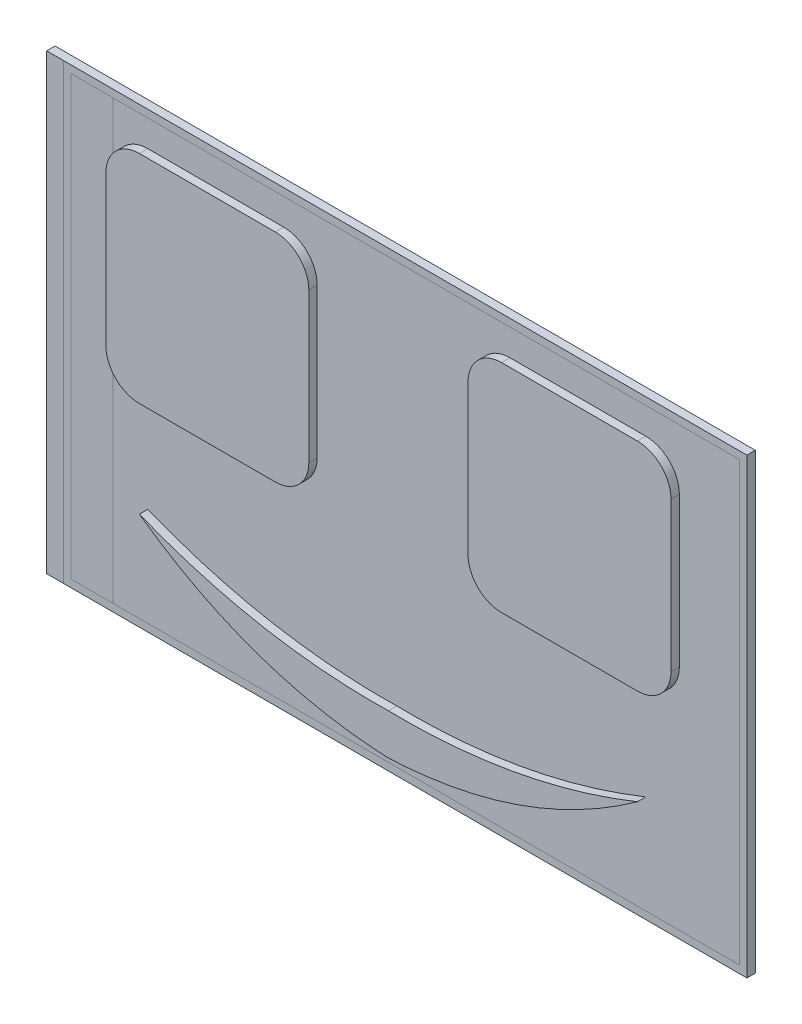
ISO-10303-21;
HEADER;
FILE_DESCRIPTION(('STEP AP214'),'2;1');
FILE_NAME('part.step','',(''),(''),'','','');
FILE_SCHEMA(('AUTOMOTIVE_DESIGN { 1 0 10303 214 1 1 1 1 }'));
ENDSEC;
DATA;
#1=APPLICATION_CONTEXT('core data for automotive mechanical design processes');
#2=APPLICATION_PROTOCOL_DEFINITION('international standard','automotive_design',2000,#1);
#3=PRODUCT_CONTEXT('',#1,'mechanical');
#4=PRODUCT('Part','Part','',(#3));
#5=PRODUCT_RELATED_PRODUCT_CATEGORY('part','',(#4));
#6=PRODUCT_DEFINITION_FORMATION('','',#4);
#7=PRODUCT_DEFINITION_CONTEXT('part definition',#1,'design');
#8=PRODUCT_DEFINITION('design','',#6,#7);
#9=PRODUCT_DEFINITION_SHAPE('','',#8);
#10=(LENGTH_UNIT() NAMED_UNIT(*) SI_UNIT(.MILLI.,.METRE.));
#11=(NAMED_UNIT(*) PLANE_ANGLE_UNIT() SI_UNIT($,.RADIAN.));
#12=(NAMED_UNIT(*) SI_UNIT($,.STERADIAN.) SOLID_ANGLE_UNIT());
#13=UNCERTAINTY_MEASURE_WITH_UNIT(LENGTH_MEASURE(1.E-05),#10,'distance_accuracy_value','');
#14=(GEOMETRIC_REPRESENTATION_CONTEXT(3) GLOBAL_UNCERTAINTY_ASSIGNED_CONTEXT((#13)) GLOBAL_UNIT_ASSIGNED_CONTEXT((#10,
#11,#12)) REPRESENTATION_CONTEXT('',''));
#15=CARTESIAN_POINT('',(0.,0.,0.));
#16=DIRECTION('',(0.,0.,1.));
#17=DIRECTION('',(1.,0.,0.));
#18=AXIS2_PLACEMENT_3D('',#15,#16,#17);
#19=CARTESIAN_POINT('',(0.,0.,4.));
#20=DIRECTION('',(0.,0.,1.));
#21=DIRECTION('',(1.,0.,0.));
#22=AXIS2_PLACEMENT_3D('',#19,#20,#21);
#23=PLANE('',#22);
#24=CARTESIAN_POINT('',(-29.6936225832858,-14.3272413143272,4.));
#25=CARTESIAN_POINT('',(-15.3381397208597,-20.090888715164,4.));
#26=CARTESIAN_POINT('',(-2.72004641033163E-12,-19.7764522537227,4.));
#27=B_SPLINE_CURVE_WITH_KNOTS('',2,(#24,#25,#26),.UNSPECIFIED.,.F.,.F.,(3,3),(0.,1.),.UNSPECIFIED.);
#28=CARTESIAN_POINT('',(-29.6936225832858,-14.3272413143272,4.));
#29=VERTEX_POINT('',#28);
#30=CARTESIAN_POINT('',(-2.80331313717852E-12,-19.7764522537227,4.));
#31=VERTEX_POINT('',#30);
#32=EDGE_CURVE('E233',#29,#31,#27,.T.);
#33=ORIENTED_EDGE('',*,*,#32,.T.);
#34=CARTESIAN_POINT('',(29.6936225832858,-14.3272413143265,4.));
#35=CARTESIAN_POINT('',(15.3381397208541,-20.0908887151647,4.));
#36=CARTESIAN_POINT('',(-2.88657986402541E-12,-19.7764522537227,4.));
#37=B_SPLINE_CURVE_WITH_KNOTS('',2,(#34,#35,#36),.UNSPECIFIED.,.F.,.F.,(3,3),(0.,1.),.UNSPECIFIED.);
#38=CARTESIAN_POINT('',(29.6936225832858,-14.3272413143265,4.));
#39=VERTEX_POINT('',#38);
#40=EDGE_CURVE('E252',#39,#31,#37,.T.);
#41=ORIENTED_EDGE('',*,*,#40,.F.);
#42=CARTESIAN_POINT('',(29.6936225832858,-14.3272413143265,4.));
#43=CARTESIAN_POINT('',(16.2293334087923,-23.9678209764464,4.));
#44=CARTESIAN_POINT('',(-2.88657986402541E-12,-24.6577244943396,4.));
#45=B_SPLINE_CURVE_WITH_KNOTS('',2,(#42,#43,#44),.UNSPECIFIED.,.F.,.F.,(3,3),(0.,1.),.UNSPECIFIED.);
#46=CARTESIAN_POINT('',(-2.80331313717852E-12,-24.6577244943396,4.));
#47=VERTEX_POINT('',#46);
#48=EDGE_CURVE('E57',#39,#47,#45,.T.);
#49=ORIENTED_EDGE('',*,*,#48,.T.);
#50=CARTESIAN_POINT('',(-29.6936225832858,-14.3272413143272,4.));
#51=CARTESIAN_POINT('',(-16.2293334087979,-23.9678209764464,4.));
#52=CARTESIAN_POINT('',(-2.72004641033163E-12,-24.6577244943396,4.));
#53=B_SPLINE_CURVE_WITH_KNOTS('',2,(#50,#51,#52),.UNSPECIFIED.,.F.,.F.,(3,3),(0.,1.),.UNSPECIFIED.);
#54=EDGE_CURVE('E737',#29,#47,#53,.T.);
#55=ORIENTED_EDGE('',*,*,#54,.F.);
#56=EDGE_LOOP('',(#33,#41,#49,#55));
#57=FACE_BOUND('',#56,.T.);
#58=CARTESIAN_POINT('',(13.4952908757193,18.9268430031263,4.));
#59=DIRECTION('',(0.,0.,0.999999999999991));
#60=DIRECTION('',(0.999999999999991,0.,0.));
#61=AXIS2_PLACEMENT_3D('',#58,#59,#60);
#62=CIRCLE('',#61,4.);
#63=CARTESIAN_POINT('',(9.49529087571932,18.9268430031263,4.));
#64=VERTEX_POINT('',#63);
#65=CARTESIAN_POINT('',(13.4952908757193,22.9268430031263,4.));
#66=VERTEX_POINT('',#65);
#67=EDGE_CURVE('E237',#64,#66,#62,.F.);
#68=ORIENTED_EDGE('',*,*,#67,.T.);
#69=DIRECTION('',(0.999999999999991,0.,0.));
#70=VECTOR('',#69,1.);
#71=CARTESIAN_POINT('',(0.,22.9268430031269,4.));
#72=LINE('',#71,#70);
#73=CARTESIAN_POINT('',(29.6936225832858,22.9268430031269,4.));
#74=VERTEX_POINT('',#73);
#75=EDGE_CURVE('E766',#66,#74,#72,.T.);
#76=ORIENTED_EDGE('',*,*,#75,.T.);
#77=CARTESIAN_POINT('',(29.6936225832858,18.9268430031268,4.));
#78=DIRECTION('',(0.,0.,0.999999999999991));
#79=DIRECTION('',(0.999999999999991,0.,0.));
#80=AXIS2_PLACEMENT_3D('',#77,#78,#79);
#81=CIRCLE('',#80,4.);
#82=CARTESIAN_POINT('',(33.6936225832858,18.9268430031268,4.));
#83=VERTEX_POINT('',#82);
#84=EDGE_CURVE('E797',#74,#83,#81,.F.);
#85=ORIENTED_EDGE('',*,*,#84,.T.);
#86=DIRECTION('',(0.,-1.,0.));
#87=VECTOR('',#86,1.);
#88=CARTESIAN_POINT('',(33.6936225832858,0.,4.));
#89=LINE('',#88,#87);
#90=CARTESIAN_POINT('',(33.6936225832858,1.10459654617266,4.));
#91=VERTEX_POINT('',#90);
#92=EDGE_CURVE('E795',#83,#91,#89,.T.);
#93=ORIENTED_EDGE('',*,*,#92,.T.);
#94=CARTESIAN_POINT('',(29.6936225832858,1.10459654617266,4.));
#95=DIRECTION('',(0.,0.,0.999999999999991));
#96=DIRECTION('',(0.999999999999991,0.,0.));
#97=AXIS2_PLACEMENT_3D('',#94,#95,#96);
#98=CIRCLE('',#97,4.);
#99=CARTESIAN_POINT('',(29.6936225832858,-2.89540345382734,4.));
#100=VERTEX_POINT('',#99);
#101=EDGE_CURVE('E792',#100,#91,#98,.T.);
#102=ORIENTED_EDGE('',*,*,#101,.F.);
#103=DIRECTION('',(0.999999999999991,0.,0.));
#104=VECTOR('',#103,1.);
#105=CARTESIAN_POINT('',(0.,-2.89540345382733,4.));
#106=LINE('',#105,#104);
#107=CARTESIAN_POINT('',(13.4952908757193,-2.89540345382733,4.));
#108=VERTEX_POINT('',#107);
#109=EDGE_CURVE('E789',#108,#100,#106,.T.);
#110=ORIENTED_EDGE('',*,*,#109,.F.);
#111=CARTESIAN_POINT('',(13.4952908757193,1.10459654617212,4.));
#112=DIRECTION('',(0.,0.,0.999999999999991));
#113=DIRECTION('',(0.999999999999991,0.,0.));
#114=AXIS2_PLACEMENT_3D('',#111,#112,#113);
#115=CIRCLE('',#114,4.);
#116=CARTESIAN_POINT('',(9.49529087571932,1.10459654617212,4.));
#117=VERTEX_POINT('',#116);
#118=EDGE_CURVE('E786',#117,#108,#115,.T.);
#119=ORIENTED_EDGE('',*,*,#118,.F.);
#120=DIRECTION('',(0.,-1.,0.));
#121=VECTOR('',#120,1.);
#122=CARTESIAN_POINT('',(9.49529087571932,-5.55111512312578E-13,4.));
#123=LINE('',#122,#121);
#124=EDGE_CURVE('E65',#64,#117,#123,.T.);
#125=ORIENTED_EDGE('',*,*,#124,.F.);
#126=EDGE_LOOP('',(#68,#76,#85,#93,#102,#110,#119,#125));
#127=FACE_BOUND('',#126,.T.);
#128=CARTESIAN_POINT('',(-29.6936225832858,18.9268430031264,4.));
#129=DIRECTION('',(0.,0.,0.999999999999993));
#130=DIRECTION('',(0.999999999999993,0.,0.));
#131=AXIS2_PLACEMENT_3D('',#128,#129,#130);
#132=CIRCLE('',#131,4.);
#133=CARTESIAN_POINT('',(-29.6936225832858,22.9268430031264,4.));
#134=VERTEX_POINT('',#133);
#135=CARTESIAN_POINT('',(-33.6936225832858,18.9268430031269,4.));
#136=VERTEX_POINT('',#135);
#137=EDGE_CURVE('E847',#134,#136,#132,.T.);
#138=ORIENTED_EDGE('',*,*,#137,.F.);
#139=DIRECTION('',(-0.999999999999993,0.,0.));
#140=VECTOR('',#139,1.);
#141=CARTESIAN_POINT('',(0.,22.9268430031269,4.));
#142=LINE('',#141,#140);
#143=CARTESIAN_POINT('',(-13.4952908757193,22.9268430031269,4.));
#144=VERTEX_POINT('',#143);
#145=EDGE_CURVE('E822',#144,#134,#142,.T.);
#146=ORIENTED_EDGE('',*,*,#145,.F.);
#147=CARTESIAN_POINT('',(-13.4952908757193,18.9268430031269,4.));
#148=DIRECTION('',(0.,0.,0.999999999999993));
#149=DIRECTION('',(0.999999999999993,0.,0.));
#150=AXIS2_PLACEMENT_3D('',#147,#148,#149);
#151=CIRCLE('',#150,4.);
#152=CARTESIAN_POINT('',(-9.49529087571932,18.9268430031269,4.));
#153=VERTEX_POINT('',#152);
#154=EDGE_CURVE('E827',#153,#144,#151,.T.);
#155=ORIENTED_EDGE('',*,*,#154,.F.);
#156=DIRECTION('',(0.,-1.,0.));
#157=VECTOR('',#156,1.);
#158=CARTESIAN_POINT('',(-9.49529087571932,0.,4.));
#159=LINE('',#158,#157);
#160=CARTESIAN_POINT('',(-9.49529087571932,1.10459654617266,4.));
#161=VERTEX_POINT('',#160);
#162=EDGE_CURVE('E861',#153,#161,#159,.T.);
#163=ORIENTED_EDGE('',*,*,#162,.T.);
#164=CARTESIAN_POINT('',(-13.4952908757193,1.10459654617222,4.));
#165=DIRECTION('',(0.,0.,0.999999999999993));
#166=DIRECTION('',(0.999999999999993,0.,0.));
#167=AXIS2_PLACEMENT_3D('',#164,#165,#166);
#168=CIRCLE('',#167,4.);
#169=CARTESIAN_POINT('',(-13.4952908757193,-2.89540345382733,4.));
#170=VERTEX_POINT('',#169);
#171=EDGE_CURVE('E858',#161,#170,#168,.F.);
#172=ORIENTED_EDGE('',*,*,#171,.T.);
#173=DIRECTION('',(-0.999999999999993,0.,0.));
#174=VECTOR('',#173,1.);
#175=CARTESIAN_POINT('',(0.,-2.89540345382733,4.));
#176=LINE('',#175,#174);
#177=CARTESIAN_POINT('',(-29.6936225832858,-2.89540345382779,4.));
#178=VERTEX_POINT('',#177);
#179=EDGE_CURVE('E855',#170,#178,#176,.T.);
#180=ORIENTED_EDGE('',*,*,#179,.T.);
#181=CARTESIAN_POINT('',(-29.6936225832858,1.10459654617222,4.));
#182=DIRECTION('',(0.,0.,0.999999999999993));
#183=DIRECTION('',(0.999999999999993,0.,0.));
#184=AXIS2_PLACEMENT_3D('',#181,#182,#183);
#185=CIRCLE('',#184,4.);
#186=CARTESIAN_POINT('',(-33.6936225832858,1.10459654617268,4.));
#187=VERTEX_POINT('',#186);
#188=EDGE_CURVE('E852',#178,#187,#185,.F.);
#189=ORIENTED_EDGE('',*,*,#188,.T.);
#190=DIRECTION('',(0.,-1.,0.));
#191=VECTOR('',#190,1.);
#192=CARTESIAN_POINT('',(-33.6936225832858,0.,4.));
#193=LINE('',#192,#191);
#194=EDGE_CURVE('E849',#136,#187,#193,.T.);
#195=ORIENTED_EDGE('',*,*,#194,.F.);
#196=EDGE_LOOP('',(#138,#146,#155,#163,#172,#180,#189,#195));
#197=FACE_BOUND('',#196,.T.);
#198=DIRECTION('',(0.,1.,0.));
#199=VECTOR('',#198,1.);
#200=CARTESIAN_POINT('',(-33.8500000000466,13.0510000005015,4.));
#201=LINE('',#200,#199);
#202=CARTESIAN_POINT('',(-33.8500000000466,-26.1000000000029,4.));
#203=VERTEX_POINT('',#202);
#204=CARTESIAN_POINT('',(-33.8500000000466,26.1000000000029,4.));
#205=VERTEX_POINT('',#204);
#206=EDGE_CURVE('E11',#203,#205,#201,.T.);
#207=ORIENTED_EDGE('',*,*,#206,.F.);
#208=DIRECTION('',(-1.,0.,0.));
#209=VECTOR('',#208,1.);
#210=CARTESIAN_POINT('',(-19.4250000000233,-26.1000000000029,4.));
#211=LINE('',#210,#209);
#212=CARTESIAN_POINT('',(40.850000000032,-26.1000000000029,4.));
#213=VERTEX_POINT('',#212);
#214=EDGE_CURVE('E405',#213,#203,#211,.T.);
#215=ORIENTED_EDGE('',*,*,#214,.F.);
#216=DIRECTION('',(0.,-1.,0.));
#217=VECTOR('',#216,1.);
#218=CARTESIAN_POINT('',(40.850000000032,-13.0500000000015,4.));
#219=LINE('',#218,#217);
#220=CARTESIAN_POINT('',(40.850000000032,26.1000000000029,4.));
#221=VERTEX_POINT('',#220);
#222=EDGE_CURVE('E422',#221,#213,#219,.T.);
#223=ORIENTED_EDGE('',*,*,#222,.F.);
#224=DIRECTION('',(1.,0.,0.));
#225=VECTOR('',#224,1.);
#226=CARTESIAN_POINT('',(20.425000000016,26.1000000000029,4.));
#227=LINE('',#226,#225);
#228=EDGE_CURVE('E410',#205,#221,#227,.T.);
#229=ORIENTED_EDGE('',*,*,#228,.F.);
#230=EDGE_LOOP('',(#207,#215,#223,#229));
#231=FACE_BOUND('',#230,.T.);
#232=ADVANCED_FACE('F39',(#57,#127,#197,#231),#23,.T.);
#233=CARTESIAN_POINT('',(0.,0.,4.));
#234=DIRECTION('',(0.,0.,1.));
#235=DIRECTION('',(1.,0.,0.));
#236=AXIS2_PLACEMENT_3D('',#233,#234,#235);
#237=PLANE('',#236);
#238=ORIENTED_EDGE('',*,*,#206,.T.);
#239=DIRECTION('',(1.,0.,0.));
#240=VECTOR('',#239,1.);
#241=CARTESIAN_POINT('',(20.425000000016,26.1000000000029,4.));
#242=LINE('',#241,#240);
#243=CARTESIAN_POINT('',(-38.8500000000466,26.1000000000029,4.));
#244=VERTEX_POINT('',#243);
#245=EDGE_CURVE('E396',#244,#205,#242,.T.);
#246=ORIENTED_EDGE('',*,*,#245,.F.);
#247=DIRECTION('',(0.,1.,0.));
#248=VECTOR('',#247,1.);
#249=CARTESIAN_POINT('',(-38.8500000000466,13.0500000000014,4.));
#250=LINE('',#249,#248);
#251=CARTESIAN_POINT('',(-38.8500000000466,-26.1000000000029,4.));
#252=VERTEX_POINT('',#251);
#253=EDGE_CURVE('E406',#252,#244,#250,.T.);
#254=ORIENTED_EDGE('',*,*,#253,.F.);
#255=DIRECTION('',(-1.,0.,0.));
#256=VECTOR('',#255,1.);
#257=CARTESIAN_POINT('',(-19.4250000000233,-26.1000000000029,4.));
#258=LINE('',#257,#256);
#259=EDGE_CURVE('E402',#203,#252,#258,.T.);
#260=ORIENTED_EDGE('',*,*,#259,.F.);
#261=EDGE_LOOP('',(#238,#246,#254,#260));
#262=FACE_BOUND('',#261,.T.);
#263=ADVANCED_FACE('F359',(#262),#237,.T.);
#264=CARTESIAN_POINT('',(0.,0.,4.));
#265=DIRECTION('',(0.,0.,1.));
#266=DIRECTION('',(1.,0.,0.));
#267=AXIS2_PLACEMENT_3D('',#264,#265,#266);
#268=PLANE('',#267);
#269=DIRECTION('',(0.,-1.,0.));
#270=VECTOR('',#269,1.);
#271=CARTESIAN_POINT('',(-39.75,13.5,4.));
#272=LINE('',#271,#270);
#273=CARTESIAN_POINT('',(-39.75,27.,4.));
#274=VERTEX_POINT('',#273);
#275=CARTESIAN_POINT('',(-39.75,-27.,4.));
#276=VERTEX_POINT('',#275);
#277=EDGE_CURVE('E414',#274,#276,#272,.T.);
#278=ORIENTED_EDGE('',*,*,#277,.F.);
#279=DIRECTION('',(-1.,0.,0.));
#280=VECTOR('',#279,1.);
#281=CARTESIAN_POINT('',(41.75,27.,4.));
#282=LINE('',#281,#280);
#283=CARTESIAN_POINT('',(-41.75,27.,4.));
#284=VERTEX_POINT('',#283);
#285=EDGE_CURVE('E49',#274,#284,#282,.T.);
#286=ORIENTED_EDGE('',*,*,#285,.T.);
#287=DIRECTION('',(0.,-1.,0.));
#288=VECTOR('',#287,1.);
#289=CARTESIAN_POINT('',(-41.75,27.,4.));
#290=LINE('',#289,#288);
#291=CARTESIAN_POINT('',(-41.75,-27.,4.));
#292=VERTEX_POINT('',#291);
#293=EDGE_CURVE('E417',#284,#292,#290,.T.);
#294=ORIENTED_EDGE('',*,*,#293,.T.);
#295=DIRECTION('',(1.,0.,0.));
#296=VECTOR('',#295,1.);
#297=CARTESIAN_POINT('',(-41.75,-27.,4.));
#298=LINE('',#297,#296);
#299=EDGE_CURVE('E421',#292,#276,#298,.T.);
#300=ORIENTED_EDGE('',*,*,#299,.T.);
#301=EDGE_LOOP('',(#278,#286,#294,#300));
#302=FACE_BOUND('',#301,.T.);
#303=ADVANCED_FACE('F347',(#302),#268,.T.);
#304=CARTESIAN_POINT('',(41.75,27.,3.));
#305=DIRECTION('',(0.,1.,0.));
#306=DIRECTION('',(-1.,0.,0.));
#307=AXIS2_PLACEMENT_3D('',#304,#305,#306);
#308=PLANE('',#307);
#309=DIRECTION('',(-1.,0.,0.));
#310=VECTOR('',#309,1.);
#311=CARTESIAN_POINT('',(41.75,27.,3.));
#312=LINE('',#311,#310);
#313=CARTESIAN_POINT('',(41.75,27.,3.));
#314=VERTEX_POINT('',#313);
#315=CARTESIAN_POINT('',(-41.75,27.,3.));
#316=VERTEX_POINT('',#315);
#317=EDGE_CURVE('E462',#314,#316,#312,.T.);
#318=ORIENTED_EDGE('',*,*,#317,.T.);
#319=DIRECTION('',(0.,0.,1.));
#320=VECTOR('',#319,1.);
#321=CARTESIAN_POINT('',(-41.75,27.,3.));
#322=LINE('',#321,#320);
#323=EDGE_CURVE('E381',#316,#284,#322,.T.);
#324=ORIENTED_EDGE('',*,*,#323,.T.);
#325=ORIENTED_EDGE('',*,*,#285,.F.);
#326=DIRECTION('',(-1.,0.,0.));
#327=VECTOR('',#326,1.);
#328=CARTESIAN_POINT('',(41.75,27.,4.));
#329=LINE('',#328,#327);
#330=CARTESIAN_POINT('',(41.75,27.,4.));
#331=VERTEX_POINT('',#330);
#332=EDGE_CURVE('E400',#331,#274,#329,.T.);
#333=ORIENTED_EDGE('',*,*,#332,.F.);
#334=DIRECTION('',(0.,0.,1.));
#335=VECTOR('',#334,1.);
#336=CARTESIAN_POINT('',(41.75,27.,3.));
#337=LINE('',#336,#335);
#338=EDGE_CURVE('E43',#314,#331,#337,.T.);
#339=ORIENTED_EDGE('',*,*,#338,.F.);
#340=EDGE_LOOP('',(#318,#324,#325,#333,#339));
#341=FACE_BOUND('',#340,.T.);
#342=ADVANCED_FACE('F344',(#341),#308,.T.);
#343=CARTESIAN_POINT('',(41.75,-27.,3.));
#344=DIRECTION('',(1.,0.,0.));
#345=DIRECTION('',(0.,1.,0.));
#346=AXIS2_PLACEMENT_3D('',#343,#344,#345);
#347=PLANE('',#346);
#348=DIRECTION('',(0.,1.,0.));
#349=VECTOR('',#348,1.);
#350=CARTESIAN_POINT('',(41.75,-27.,3.));
#351=LINE('',#350,#349);
#352=CARTESIAN_POINT('',(41.75,-27.,3.));
#353=VERTEX_POINT('',#352);
#354=EDGE_CURVE('E466',#353,#314,#351,.T.);
#355=ORIENTED_EDGE('',*,*,#354,.T.);
#356=ORIENTED_EDGE('',*,*,#338,.T.);
#357=DIRECTION('',(0.,1.,0.));
#358=VECTOR('',#357,1.);
#359=CARTESIAN_POINT('',(41.75,-27.,4.));
#360=LINE('',#359,#358);
#361=CARTESIAN_POINT('',(41.75,-27.,4.));
#362=VERTEX_POINT('',#361);
#363=EDGE_CURVE('E415',#362,#331,#360,.T.);
#364=ORIENTED_EDGE('',*,*,#363,.F.);
#365=DIRECTION('',(0.,0.,1.));
#366=VECTOR('',#365,1.);
#367=CARTESIAN_POINT('',(41.75,-27.,3.));
#368=LINE('',#367,#366);
#369=EDGE_CURVE('E386',#353,#362,#368,.T.);
#370=ORIENTED_EDGE('',*,*,#369,.F.);
#371=EDGE_LOOP('',(#355,#356,#364,#370));
#372=FACE_BOUND('',#371,.T.);
#373=ADVANCED_FACE('F41',(#372),#347,.T.);
#374=CARTESIAN_POINT('',(-41.75,-27.,3.));
#375=DIRECTION('',(0.,-1.,0.));
#376=DIRECTION('',(1.,0.,0.));
#377=AXIS2_PLACEMENT_3D('',#374,#375,#376);
#378=PLANE('',#377);
#379=DIRECTION('',(1.,0.,0.));
#380=VECTOR('',#379,1.);
#381=CARTESIAN_POINT('',(-41.75,-27.,3.));
#382=LINE('',#381,#380);
#383=CARTESIAN_POINT('',(-41.75,-27.,3.));
#384=VERTEX_POINT('',#383);
#385=EDGE_CURVE('E393',#384,#353,#382,.T.);
#386=ORIENTED_EDGE('',*,*,#385,.T.);
#387=ORIENTED_EDGE('',*,*,#369,.T.);
#388=DIRECTION('',(1.,0.,0.));
#389=VECTOR('',#388,1.);
#390=CARTESIAN_POINT('',(-41.75,-27.,4.));
#391=LINE('',#390,#389);
#392=EDGE_CURVE('E411',#276,#362,#391,.T.);
#393=ORIENTED_EDGE('',*,*,#392,.F.);
#394=ORIENTED_EDGE('',*,*,#299,.F.);
#395=DIRECTION('',(0.,0.,1.));
#396=VECTOR('',#395,1.);
#397=CARTESIAN_POINT('',(-41.75,-27.,3.));
#398=LINE('',#397,#396);
#399=EDGE_CURVE('E379',#384,#292,#398,.T.);
#400=ORIENTED_EDGE('',*,*,#399,.F.);
#401=EDGE_LOOP('',(#386,#387,#393,#394,#400));
#402=FACE_BOUND('',#401,.T.);
#403=ADVANCED_FACE('F367',(#402),#378,.T.);
#404=CARTESIAN_POINT('',(-41.75,27.,3.));
#405=DIRECTION('',(-1.,0.,0.));
#406=DIRECTION('',(0.,-1.,0.));
#407=AXIS2_PLACEMENT_3D('',#404,#405,#406);
#408=PLANE('',#407);
#409=DIRECTION('',(0.,-1.,0.));
#410=VECTOR('',#409,1.);
#411=CARTESIAN_POINT('',(-41.75,27.,3.));
#412=LINE('',#411,#410);
#413=EDGE_CURVE('E378',#316,#384,#412,.T.);
#414=ORIENTED_EDGE('',*,*,#413,.T.);
#415=ORIENTED_EDGE('',*,*,#399,.T.);
#416=ORIENTED_EDGE('',*,*,#293,.F.);
#417=ORIENTED_EDGE('',*,*,#323,.F.);
#418=EDGE_LOOP('',(#414,#415,#416,#417));
#419=FACE_BOUND('',#418,.T.);
#420=ADVANCED_FACE('F352',(#419),#408,.T.);
#421=CARTESIAN_POINT('',(0.,0.,4.));
#422=DIRECTION('',(0.,0.,1.));
#423=DIRECTION('',(1.,0.,0.));
#424=AXIS2_PLACEMENT_3D('',#421,#422,#423);
#425=PLANE('',#424);
#426=ORIENTED_EDGE('',*,*,#245,.T.);
#427=ORIENTED_EDGE('',*,*,#228,.T.);
#428=ORIENTED_EDGE('',*,*,#222,.T.);
#429=ORIENTED_EDGE('',*,*,#214,.T.);
#430=ORIENTED_EDGE('',*,*,#259,.T.);
#431=ORIENTED_EDGE('',*,*,#253,.T.);
#432=EDGE_LOOP('',(#426,#427,#428,#429,#430,#431));
#433=FACE_BOUND('',#432,.T.);
#434=ORIENTED_EDGE('',*,*,#277,.T.);
#435=ORIENTED_EDGE('',*,*,#392,.T.);
#436=ORIENTED_EDGE('',*,*,#363,.T.);
#437=ORIENTED_EDGE('',*,*,#332,.T.);
#438=EDGE_LOOP('',(#434,#435,#436,#437));
#439=FACE_BOUND('',#438,.T.);
#440=ADVANCED_FACE('F349',(#433,#439),#425,.T.);
#441=CARTESIAN_POINT('',(0.,0.,3.));
#442=DIRECTION('',(0.,0.,1.));
#443=DIRECTION('',(1.,0.,0.));
#444=AXIS2_PLACEMENT_3D('',#441,#442,#443);
#445=PLANE('',#444);
#446=ORIENTED_EDGE('',*,*,#413,.F.);
#447=ORIENTED_EDGE('',*,*,#317,.F.);
#448=ORIENTED_EDGE('',*,*,#354,.F.);
#449=ORIENTED_EDGE('',*,*,#385,.F.);
#450=EDGE_LOOP('',(#446,#447,#448,#449));
#451=FACE_BOUND('',#450,.T.);
#452=ADVANCED_FACE('F342',(#451),#445,.F.);
#453=CARTESIAN_POINT('',(0.,22.9268430031269,5.));
#454=DIRECTION('',(0.,-1.,0.));
#455=DIRECTION('',(1.,0.,0.));
#456=AXIS2_PLACEMENT_3D('',#453,#454,#455);
#457=PLANE('',#456);
#458=ORIENTED_EDGE('',*,*,#145,.T.);
#459=DIRECTION('',(0.,0.,-1.));
#460=VECTOR('',#459,1.);
#461=CARTESIAN_POINT('',(-29.6936225832858,22.9268430031264,5.));
#462=LINE('',#461,#460);
#463=CARTESIAN_POINT('',(-29.6936225832858,22.9268430031264,5.));
#464=VERTEX_POINT('',#463);
#465=EDGE_CURVE('E433',#464,#134,#462,.T.);
#466=ORIENTED_EDGE('',*,*,#465,.F.);
#467=DIRECTION('',(-0.999999999999993,0.,0.));
#468=VECTOR('',#467,1.);
#469=CARTESIAN_POINT('',(0.,22.9268430031269,5.));
#470=LINE('',#469,#468);
#471=CARTESIAN_POINT('',(-13.4952908757193,22.9268430031269,5.));
#472=VERTEX_POINT('',#471);
#473=EDGE_CURVE('E823',#472,#464,#470,.T.);
#474=ORIENTED_EDGE('',*,*,#473,.F.);
#475=DIRECTION('',(0.,0.,-1.));
#476=VECTOR('',#475,1.);
#477=CARTESIAN_POINT('',(-13.4952908757193,22.9268430031269,5.));
#478=LINE('',#477,#476);
#479=EDGE_CURVE('E845',#472,#144,#478,.T.);
#480=ORIENTED_EDGE('',*,*,#479,.T.);
#481=EDGE_LOOP('',(#458,#466,#474,#480));
#482=FACE_BOUND('',#481,.T.);
#483=ADVANCED_FACE('F338',(#482),#457,.F.);
#484=CARTESIAN_POINT('',(-29.6936225832858,18.9268430031264,5.));
#485=DIRECTION('',(0.,0.,-1.));
#486=DIRECTION('',(-1.,0.,0.));
#487=AXIS2_PLACEMENT_3D('',#484,#485,#486);
#488=CYLINDRICAL_SURFACE('',#487,4.);
#489=ORIENTED_EDGE('',*,*,#137,.T.);
#490=DIRECTION('',(0.,0.,-1.));
#491=VECTOR('',#490,1.);
#492=CARTESIAN_POINT('',(-33.6936225832858,18.9268430031269,5.));
#493=LINE('',#492,#491);
#494=CARTESIAN_POINT('',(-33.6936225832858,18.9268430031269,5.));
#495=VERTEX_POINT('',#494);
#496=EDGE_CURVE('E436',#495,#136,#493,.T.);
#497=ORIENTED_EDGE('',*,*,#496,.F.);
#498=CARTESIAN_POINT('',(-29.6936225832858,18.9268430031264,5.));
#499=DIRECTION('',(0.,0.,0.999999999999993));
#500=DIRECTION('',(0.999999999999993,0.,0.));
#501=AXIS2_PLACEMENT_3D('',#498,#499,#500);
#502=CIRCLE('',#501,4.);
#503=EDGE_CURVE('E826',#464,#495,#502,.T.);
#504=ORIENTED_EDGE('',*,*,#503,.F.);
#505=ORIENTED_EDGE('',*,*,#465,.T.);
#506=EDGE_LOOP('',(#489,#497,#504,#505));
#507=FACE_BOUND('',#506,.T.);
#508=ADVANCED_FACE('F334',(#507),#488,.T.);
#509=CARTESIAN_POINT('',(-33.6936225832858,0.,5.));
#510=DIRECTION('',(1.,0.,0.));
#511=DIRECTION('',(0.,1.,0.));
#512=AXIS2_PLACEMENT_3D('',#509,#510,#511);
#513=PLANE('',#512);
#514=ORIENTED_EDGE('',*,*,#194,.T.);
#515=DIRECTION('',(0.,0.,-1.));
#516=VECTOR('',#515,1.);
#517=CARTESIAN_POINT('',(-33.6936225832858,1.10459654617268,5.));
#518=LINE('',#517,#516);
#519=CARTESIAN_POINT('',(-33.6936225832858,1.10459654617268,5.));
#520=VERTEX_POINT('',#519);
#521=EDGE_CURVE('E441',#520,#187,#518,.T.);
#522=ORIENTED_EDGE('',*,*,#521,.F.);
#523=DIRECTION('',(0.,-1.,0.));
#524=VECTOR('',#523,1.);
#525=CARTESIAN_POINT('',(-33.6936225832858,0.,5.));
#526=LINE('',#525,#524);
#527=EDGE_CURVE('E829',#495,#520,#526,.T.);
#528=ORIENTED_EDGE('',*,*,#527,.F.);
#529=ORIENTED_EDGE('',*,*,#496,.T.);
#530=EDGE_LOOP('',(#514,#522,#528,#529));
#531=FACE_BOUND('',#530,.T.);
#532=ADVANCED_FACE('F330',(#531),#513,.F.);
#533=CARTESIAN_POINT('',(-29.6936225832858,1.10459654617222,5.));
#534=DIRECTION('',(0.,0.,-1.));
#535=DIRECTION('',(-1.,0.,0.));
#536=AXIS2_PLACEMENT_3D('',#533,#534,#535);
#537=CYLINDRICAL_SURFACE('',#536,4.);
#538=ORIENTED_EDGE('',*,*,#188,.F.);
#539=DIRECTION('',(0.,0.,-1.));
#540=VECTOR('',#539,1.);
#541=CARTESIAN_POINT('',(-29.6936225832858,-2.89540345382779,5.));
#542=LINE('',#541,#540);
#543=CARTESIAN_POINT('',(-29.6936225832858,-2.89540345382779,5.));
#544=VERTEX_POINT('',#543);
#545=EDGE_CURVE('E874',#544,#178,#542,.T.);
#546=ORIENTED_EDGE('',*,*,#545,.F.);
#547=CARTESIAN_POINT('',(-29.6936225832858,1.10459654617222,5.));
#548=DIRECTION('',(0.,0.,0.999999999999993));
#549=DIRECTION('',(0.999999999999993,0.,0.));
#550=AXIS2_PLACEMENT_3D('',#547,#548,#549);
#551=CIRCLE('',#550,4.);
#552=EDGE_CURVE('E831',#544,#520,#551,.F.);
#553=ORIENTED_EDGE('',*,*,#552,.T.);
#554=ORIENTED_EDGE('',*,*,#521,.T.);
#555=EDGE_LOOP('',(#538,#546,#553,#554));
#556=FACE_BOUND('',#555,.T.);
#557=ADVANCED_FACE('F326',(#556),#537,.T.);
#558=CARTESIAN_POINT('',(0.,-2.89540345382733,5.));
#559=DIRECTION('',(0.,-1.,0.));
#560=DIRECTION('',(1.,0.,0.));
#561=AXIS2_PLACEMENT_3D('',#558,#559,#560);
#562=PLANE('',#561);
#563=ORIENTED_EDGE('',*,*,#179,.F.);
#564=DIRECTION('',(0.,0.,-1.));
#565=VECTOR('',#564,1.);
#566=CARTESIAN_POINT('',(-13.4952908757193,-2.89540345382733,5.));
#567=LINE('',#566,#565);
#568=CARTESIAN_POINT('',(-13.4952908757193,-2.89540345382733,5.));
#569=VERTEX_POINT('',#568);
#570=EDGE_CURVE('E872',#569,#170,#567,.T.);
#571=ORIENTED_EDGE('',*,*,#570,.F.);
#572=DIRECTION('',(-0.999999999999993,0.,0.));
#573=VECTOR('',#572,1.);
#574=CARTESIAN_POINT('',(0.,-2.89540345382733,5.));
#575=LINE('',#574,#573);
#576=EDGE_CURVE('E834',#569,#544,#575,.T.);
#577=ORIENTED_EDGE('',*,*,#576,.T.);
#578=ORIENTED_EDGE('',*,*,#545,.T.);
#579=EDGE_LOOP('',(#563,#571,#577,#578));
#580=FACE_BOUND('',#579,.T.);
#581=ADVANCED_FACE('F322',(#580),#562,.T.);
#582=CARTESIAN_POINT('',(-13.4952908757193,1.10459654617222,5.));
#583=DIRECTION('',(0.,0.,-1.));
#584=DIRECTION('',(-1.,0.,0.));
#585=AXIS2_PLACEMENT_3D('',#582,#583,#584);
#586=CYLINDRICAL_SURFACE('',#585,4.);
#587=ORIENTED_EDGE('',*,*,#171,.F.);
#588=DIRECTION('',(0.,0.,-1.));
#589=VECTOR('',#588,1.);
#590=CARTESIAN_POINT('',(-9.49529087571932,1.10459654617266,5.));
#591=LINE('',#590,#589);
#592=CARTESIAN_POINT('',(-9.49529087571932,1.10459654617266,5.));
#593=VERTEX_POINT('',#592);
#594=EDGE_CURVE('E870',#593,#161,#591,.T.);
#595=ORIENTED_EDGE('',*,*,#594,.F.);
#596=CARTESIAN_POINT('',(-13.4952908757193,1.10459654617222,5.));
#597=DIRECTION('',(0.,0.,0.999999999999993));
#598=DIRECTION('',(0.999999999999993,0.,0.));
#599=AXIS2_PLACEMENT_3D('',#596,#597,#598);
#600=CIRCLE('',#599,4.);
#601=EDGE_CURVE('E837',#593,#569,#600,.F.);
#602=ORIENTED_EDGE('',*,*,#601,.T.);
#603=ORIENTED_EDGE('',*,*,#570,.T.);
#604=EDGE_LOOP('',(#587,#595,#602,#603));
#605=FACE_BOUND('',#604,.T.);
#606=ADVANCED_FACE('F318',(#605),#586,.T.);
#607=CARTESIAN_POINT('',(-9.49529087571932,0.,5.));
#608=DIRECTION('',(1.,0.,0.));
#609=DIRECTION('',(0.,1.,0.));
#610=AXIS2_PLACEMENT_3D('',#607,#608,#609);
#611=PLANE('',#610);
#612=ORIENTED_EDGE('',*,*,#162,.F.);
#613=DIRECTION('',(0.,0.,-1.));
#614=VECTOR('',#613,1.);
#615=CARTESIAN_POINT('',(-9.49529087571932,18.9268430031269,5.));
#616=LINE('',#615,#614);
#617=CARTESIAN_POINT('',(-9.49529087571932,18.9268430031269,5.));
#618=VERTEX_POINT('',#617);
#619=EDGE_CURVE('E867',#618,#153,#616,.T.);
#620=ORIENTED_EDGE('',*,*,#619,.F.);
#621=DIRECTION('',(0.,-1.,0.));
#622=VECTOR('',#621,1.);
#623=CARTESIAN_POINT('',(-9.49529087571932,0.,5.));
#624=LINE('',#623,#622);
#625=EDGE_CURVE('E840',#618,#593,#624,.T.);
#626=ORIENTED_EDGE('',*,*,#625,.T.);
#627=ORIENTED_EDGE('',*,*,#594,.T.);
#628=EDGE_LOOP('',(#612,#620,#626,#627));
#629=FACE_BOUND('',#628,.T.);
#630=ADVANCED_FACE('F314',(#629),#611,.T.);
#631=CARTESIAN_POINT('',(-13.4952908757193,18.9268430031269,5.));
#632=DIRECTION('',(0.,0.,-1.));
#633=DIRECTION('',(-1.,0.,0.));
#634=AXIS2_PLACEMENT_3D('',#631,#632,#633);
#635=CYLINDRICAL_SURFACE('',#634,4.);
#636=ORIENTED_EDGE('',*,*,#154,.T.);
#637=ORIENTED_EDGE('',*,*,#479,.F.);
#638=CARTESIAN_POINT('',(-13.4952908757193,18.9268430031269,5.));
#639=DIRECTION('',(0.,0.,0.999999999999993));
#640=DIRECTION('',(0.999999999999993,0.,0.));
#641=AXIS2_PLACEMENT_3D('',#638,#639,#640);
#642=CIRCLE('',#641,4.);
#643=EDGE_CURVE('E843',#618,#472,#642,.T.);
#644=ORIENTED_EDGE('',*,*,#643,.F.);
#645=ORIENTED_EDGE('',*,*,#619,.T.);
#646=EDGE_LOOP('',(#636,#637,#644,#645));
#647=FACE_BOUND('',#646,.T.);
#648=ADVANCED_FACE('F310',(#647),#635,.T.);
#649=CARTESIAN_POINT('',(0.,0.,5.));
#650=DIRECTION('',(0.,0.,0.999999999999993));
#651=DIRECTION('',(0.999999999999993,0.,0.));
#652=AXIS2_PLACEMENT_3D('',#649,#650,#651);
#653=PLANE('',#652);
#654=ORIENTED_EDGE('',*,*,#473,.T.);
#655=ORIENTED_EDGE('',*,*,#503,.T.);
#656=ORIENTED_EDGE('',*,*,#527,.T.);
#657=ORIENTED_EDGE('',*,*,#552,.F.);
#658=ORIENTED_EDGE('',*,*,#576,.F.);
#659=ORIENTED_EDGE('',*,*,#601,.F.);
#660=ORIENTED_EDGE('',*,*,#625,.F.);
#661=ORIENTED_EDGE('',*,*,#643,.T.);
#662=EDGE_LOOP('',(#654,#655,#656,#657,#658,#659,#660,#661));
#663=FACE_BOUND('',#662,.T.);
#664=ADVANCED_FACE('F306',(#663),#653,.T.);
#665=CARTESIAN_POINT('',(13.4952908757193,18.9268430031263,5.));
#666=DIRECTION('',(0.,0.,-1.));
#667=DIRECTION('',(-1.,0.,0.));
#668=AXIS2_PLACEMENT_3D('',#665,#666,#667);
#669=CYLINDRICAL_SURFACE('',#668,4.);
#670=ORIENTED_EDGE('',*,*,#67,.F.);
#671=DIRECTION('',(0.,0.,-1.));
#672=VECTOR('',#671,1.);
#673=CARTESIAN_POINT('',(9.49529087571932,18.9268430031263,5.));
#674=LINE('',#673,#672);
#675=CARTESIAN_POINT('',(9.49529087571932,18.9268430031263,5.));
#676=VERTEX_POINT('',#675);
#677=EDGE_CURVE('E820',#676,#64,#674,.T.);
#678=ORIENTED_EDGE('',*,*,#677,.F.);
#679=CARTESIAN_POINT('',(13.4952908757193,18.9268430031263,5.));
#680=DIRECTION('',(0.,0.,0.999999999999991));
#681=DIRECTION('',(0.999999999999991,0.,0.));
#682=AXIS2_PLACEMENT_3D('',#679,#680,#681);
#683=CIRCLE('',#682,4.);
#684=CARTESIAN_POINT('',(13.4952908757193,22.9268430031263,5.));
#685=VERTEX_POINT('',#684);
#686=EDGE_CURVE('E762',#676,#685,#683,.F.);
#687=ORIENTED_EDGE('',*,*,#686,.T.);
#688=DIRECTION('',(0.,0.,-1.));
#689=VECTOR('',#688,1.);
#690=CARTESIAN_POINT('',(13.4952908757193,22.9268430031263,5.));
#691=LINE('',#690,#689);
#692=EDGE_CURVE('E783',#685,#66,#691,.T.);
#693=ORIENTED_EDGE('',*,*,#692,.T.);
#694=EDGE_LOOP('',(#670,#678,#687,#693));
#695=FACE_BOUND('',#694,.T.);
#696=ADVANCED_FACE('F302',(#695),#669,.T.);
#697=CARTESIAN_POINT('',(9.49529087571932,-5.55111512312578E-13,5.));
#698=DIRECTION('',(1.,0.,0.));
#699=DIRECTION('',(0.,1.,0.));
#700=AXIS2_PLACEMENT_3D('',#697,#698,#699);
#701=PLANE('',#700);
#702=ORIENTED_EDGE('',*,*,#124,.T.);
#703=DIRECTION('',(0.,0.,-1.));
#704=VECTOR('',#703,1.);
#705=CARTESIAN_POINT('',(9.49529087571932,1.10459654617212,5.));
#706=LINE('',#705,#704);
#707=CARTESIAN_POINT('',(9.49529087571932,1.10459654617212,5.));
#708=VERTEX_POINT('',#707);
#709=EDGE_CURVE('E817',#708,#117,#706,.T.);
#710=ORIENTED_EDGE('',*,*,#709,.F.);
#711=DIRECTION('',(0.,-1.,0.));
#712=VECTOR('',#711,1.);
#713=CARTESIAN_POINT('',(9.49529087571932,-5.55111512312578E-13,5.));
#714=LINE('',#713,#712);
#715=EDGE_CURVE('E765',#676,#708,#714,.T.);
#716=ORIENTED_EDGE('',*,*,#715,.F.);
#717=ORIENTED_EDGE('',*,*,#677,.T.);
#718=EDGE_LOOP('',(#702,#710,#716,#717));
#719=FACE_BOUND('',#718,.T.);
#720=ADVANCED_FACE('F298',(#719),#701,.F.);
#721=CARTESIAN_POINT('',(13.4952908757193,1.10459654617212,5.));
#722=DIRECTION('',(0.,0.,-1.));
#723=DIRECTION('',(-1.,0.,0.));
#724=AXIS2_PLACEMENT_3D('',#721,#722,#723);
#725=CYLINDRICAL_SURFACE('',#724,4.);
#726=ORIENTED_EDGE('',*,*,#118,.T.);
#727=DIRECTION('',(0.,0.,-1.));
#728=VECTOR('',#727,1.);
#729=CARTESIAN_POINT('',(13.4952908757193,-2.89540345382788,5.));
#730=LINE('',#729,#728);
#731=CARTESIAN_POINT('',(13.4952908757193,-2.89540345382788,5.));
#732=VERTEX_POINT('',#731);
#733=EDGE_CURVE('E814',#732,#108,#730,.T.);
#734=ORIENTED_EDGE('',*,*,#733,.F.);
#735=CARTESIAN_POINT('',(13.4952908757193,1.10459654617212,5.));
#736=DIRECTION('',(0.,0.,0.999999999999991));
#737=DIRECTION('',(0.999999999999991,0.,0.));
#738=AXIS2_PLACEMENT_3D('',#735,#736,#737);
#739=CIRCLE('',#738,4.);
#740=EDGE_CURVE('E768',#708,#732,#739,.T.);
#741=ORIENTED_EDGE('',*,*,#740,.F.);
#742=ORIENTED_EDGE('',*,*,#709,.T.);
#743=EDGE_LOOP('',(#726,#734,#741,#742));
#744=FACE_BOUND('',#743,.T.);
#745=ADVANCED_FACE('F294',(#744),#725,.T.);
#746=CARTESIAN_POINT('',(0.,-2.89540345382733,5.));
#747=DIRECTION('',(0.,1.,0.));
#748=DIRECTION('',(-1.,0.,0.));
#749=AXIS2_PLACEMENT_3D('',#746,#747,#748);
#750=PLANE('',#749);
#751=ORIENTED_EDGE('',*,*,#109,.T.);
#752=DIRECTION('',(0.,0.,-1.));
#753=VECTOR('',#752,1.);
#754=CARTESIAN_POINT('',(29.6936225832858,-2.89540345382733,5.));
#755=LINE('',#754,#753);
#756=CARTESIAN_POINT('',(29.6936225832858,-2.89540345382733,5.));
#757=VERTEX_POINT('',#756);
#758=EDGE_CURVE('E811',#757,#100,#755,.T.);
#759=ORIENTED_EDGE('',*,*,#758,.F.);
#760=DIRECTION('',(0.999999999999991,0.,0.));
#761=VECTOR('',#760,1.);
#762=CARTESIAN_POINT('',(0.,-2.89540345382733,5.));
#763=LINE('',#762,#761);
#764=EDGE_CURVE('E770',#732,#757,#763,.T.);
#765=ORIENTED_EDGE('',*,*,#764,.F.);
#766=ORIENTED_EDGE('',*,*,#733,.T.);
#767=EDGE_LOOP('',(#751,#759,#765,#766));
#768=FACE_BOUND('',#767,.T.);
#769=ADVANCED_FACE('F290',(#768),#750,.F.);
#770=CARTESIAN_POINT('',(29.6936225832858,1.10459654617266,5.));
#771=DIRECTION('',(0.,0.,-1.));
#772=DIRECTION('',(-1.,0.,0.));
#773=AXIS2_PLACEMENT_3D('',#770,#771,#772);
#774=CYLINDRICAL_SURFACE('',#773,4.);
#775=ORIENTED_EDGE('',*,*,#101,.T.);
#776=DIRECTION('',(0.,0.,-1.));
#777=VECTOR('',#776,1.);
#778=CARTESIAN_POINT('',(33.6936225832858,1.10459654617266,5.));
#779=LINE('',#778,#777);
#780=CARTESIAN_POINT('',(33.6936225832858,1.10459654617266,5.));
#781=VERTEX_POINT('',#780);
#782=EDGE_CURVE('E808',#781,#91,#779,.T.);
#783=ORIENTED_EDGE('',*,*,#782,.F.);
#784=CARTESIAN_POINT('',(29.6936225832858,1.10459654617266,5.));
#785=DIRECTION('',(0.,0.,0.999999999999991));
#786=DIRECTION('',(0.999999999999991,0.,0.));
#787=AXIS2_PLACEMENT_3D('',#784,#785,#786);
#788=CIRCLE('',#787,4.);
#789=EDGE_CURVE('E772',#757,#781,#788,.T.);
#790=ORIENTED_EDGE('',*,*,#789,.F.);
#791=ORIENTED_EDGE('',*,*,#758,.T.);
#792=EDGE_LOOP('',(#775,#783,#790,#791));
#793=FACE_BOUND('',#792,.T.);
#794=ADVANCED_FACE('F286',(#793),#774,.T.);
#795=CARTESIAN_POINT('',(33.6936225832858,0.,5.));
#796=DIRECTION('',(1.,0.,0.));
#797=DIRECTION('',(0.,1.,0.));
#798=AXIS2_PLACEMENT_3D('',#795,#796,#797);
#799=PLANE('',#798);
#800=ORIENTED_EDGE('',*,*,#92,.F.);
#801=DIRECTION('',(0.,0.,-1.));
#802=VECTOR('',#801,1.);
#803=CARTESIAN_POINT('',(33.6936225832858,18.9268430031268,5.));
#804=LINE('',#803,#802);
#805=CARTESIAN_POINT('',(33.6936225832858,18.9268430031268,5.));
#806=VERTEX_POINT('',#805);
#807=EDGE_CURVE('E805',#806,#83,#804,.T.);
#808=ORIENTED_EDGE('',*,*,#807,.F.);
#809=DIRECTION('',(0.,-1.,0.));
#810=VECTOR('',#809,1.);
#811=CARTESIAN_POINT('',(33.6936225832858,0.,5.));
#812=LINE('',#811,#810);
#813=EDGE_CURVE('E774',#806,#781,#812,.T.);
#814=ORIENTED_EDGE('',*,*,#813,.T.);
#815=ORIENTED_EDGE('',*,*,#782,.T.);
#816=EDGE_LOOP('',(#800,#808,#814,#815));
#817=FACE_BOUND('',#816,.T.);
#818=ADVANCED_FACE('F282',(#817),#799,.T.);
#819=CARTESIAN_POINT('',(29.6936225832858,18.9268430031268,5.));
#820=DIRECTION('',(0.,0.,-1.));
#821=DIRECTION('',(-1.,0.,0.));
#822=AXIS2_PLACEMENT_3D('',#819,#820,#821);
#823=CYLINDRICAL_SURFACE('',#822,4.);
#824=ORIENTED_EDGE('',*,*,#84,.F.);
#825=DIRECTION('',(0.,0.,-1.));
#826=VECTOR('',#825,1.);
#827=CARTESIAN_POINT('',(29.6936225832858,22.9268430031268,5.));
#828=LINE('',#827,#826);
#829=CARTESIAN_POINT('',(29.6936225832858,22.9268430031268,5.));
#830=VERTEX_POINT('',#829);
#831=EDGE_CURVE('E802',#830,#74,#828,.T.);
#832=ORIENTED_EDGE('',*,*,#831,.F.);
#833=CARTESIAN_POINT('',(29.6936225832858,18.9268430031268,5.));
#834=DIRECTION('',(0.,0.,0.999999999999991));
#835=DIRECTION('',(0.999999999999991,0.,0.));
#836=AXIS2_PLACEMENT_3D('',#833,#834,#835);
#837=CIRCLE('',#836,4.);
#838=EDGE_CURVE('E777',#830,#806,#837,.F.);
#839=ORIENTED_EDGE('',*,*,#838,.T.);
#840=ORIENTED_EDGE('',*,*,#807,.T.);
#841=EDGE_LOOP('',(#824,#832,#839,#840));
#842=FACE_BOUND('',#841,.T.);
#843=ADVANCED_FACE('F278',(#842),#823,.T.);
#844=CARTESIAN_POINT('',(0.,22.9268430031269,5.));
#845=DIRECTION('',(0.,1.,0.));
#846=DIRECTION('',(-1.,0.,0.));
#847=AXIS2_PLACEMENT_3D('',#844,#845,#846);
#848=PLANE('',#847);
#849=ORIENTED_EDGE('',*,*,#75,.F.);
#850=ORIENTED_EDGE('',*,*,#692,.F.);
#851=DIRECTION('',(0.999999999999991,0.,0.));
#852=VECTOR('',#851,1.);
#853=CARTESIAN_POINT('',(0.,22.9268430031269,5.));
#854=LINE('',#853,#852);
#855=EDGE_CURVE('E780',#685,#830,#854,.T.);
#856=ORIENTED_EDGE('',*,*,#855,.T.);
#857=ORIENTED_EDGE('',*,*,#831,.T.);
#858=EDGE_LOOP('',(#849,#850,#856,#857));
#859=FACE_BOUND('',#858,.T.);
#860=ADVANCED_FACE('F274',(#859),#848,.T.);
#861=CARTESIAN_POINT('',(0.,0.,5.));
#862=DIRECTION('',(0.,0.,0.999999999999991));
#863=DIRECTION('',(0.999999999999991,0.,0.));
#864=AXIS2_PLACEMENT_3D('',#861,#862,#863);
#865=PLANE('',#864);
#866=ORIENTED_EDGE('',*,*,#686,.F.);
#867=ORIENTED_EDGE('',*,*,#715,.T.);
#868=ORIENTED_EDGE('',*,*,#740,.T.);
#869=ORIENTED_EDGE('',*,*,#764,.T.);
#870=ORIENTED_EDGE('',*,*,#789,.T.);
#871=ORIENTED_EDGE('',*,*,#813,.F.);
#872=ORIENTED_EDGE('',*,*,#838,.F.);
#873=ORIENTED_EDGE('',*,*,#855,.F.);
#874=EDGE_LOOP('',(#866,#867,#868,#869,#870,#871,#872,#873));
#875=FACE_BOUND('',#874,.T.);
#876=ADVANCED_FACE('F270',(#875),#865,.T.);
#877=CARTESIAN_POINT('',(-29.6936225832858,-14.3272413143272,5.));
#878=CARTESIAN_POINT('',(-15.3381397208597,-20.090888715164,5.));
#879=CARTESIAN_POINT('',(-2.72004641033163E-12,-19.7764522537227,5.));
#880=B_SPLINE_CURVE_WITH_KNOTS('',2,(#877,#878,#879),.UNSPECIFIED.,.F.,.F.,(3,3),(0.,1.),.UNSPECIFIED.);
#881=DIRECTION('',(0.,0.,-1.));
#882=VECTOR('',#881,1.);
#883=SURFACE_OF_LINEAR_EXTRUSION('',#880,#882);
#884=ORIENTED_EDGE('',*,*,#32,.F.);
#885=DIRECTION('',(0.,0.,-1.));
#886=VECTOR('',#885,1.);
#887=CARTESIAN_POINT('',(-29.6936225832858,-14.3272413143272,5.));
#888=LINE('',#887,#886);
#889=CARTESIAN_POINT('',(-29.6936225832858,-14.3272413143272,5.));
#890=VERTEX_POINT('',#889);
#891=EDGE_CURVE('E227',#890,#29,#888,.T.);
#892=ORIENTED_EDGE('',*,*,#891,.F.);
#893=CARTESIAN_POINT('',(-2.80331313717852E-12,-19.7764522537227,5.));
#894=VERTEX_POINT('',#893);
#895=EDGE_CURVE('E231',#890,#894,#880,.T.);
#896=ORIENTED_EDGE('',*,*,#895,.T.);
#897=DIRECTION('',(0.,0.,-1.));
#898=VECTOR('',#897,1.);
#899=CARTESIAN_POINT('',(-2.80331313717852E-12,-19.7764522537227,5.));
#900=LINE('',#899,#898);
#901=EDGE_CURVE('E727',#894,#31,#900,.T.);
#902=ORIENTED_EDGE('',*,*,#901,.T.);
#903=EDGE_LOOP('',(#884,#892,#896,#902));
#904=FACE_BOUND('',#903,.T.);
#905=ADVANCED_FACE('F229',(#904),#883,.T.);
#906=CARTESIAN_POINT('',(-29.6936225832858,-14.3272413143272,5.));
#907=CARTESIAN_POINT('',(-16.2293334087979,-23.9678209764464,5.));
#908=CARTESIAN_POINT('',(-2.72004641033163E-12,-24.6577244943396,5.));
#909=B_SPLINE_CURVE_WITH_KNOTS('',2,(#906,#907,#908),.UNSPECIFIED.,.F.,.F.,(3,3),(0.,1.),.UNSPECIFIED.);
#910=DIRECTION('',(0.,0.,-1.));
#911=VECTOR('',#910,1.);
#912=SURFACE_OF_LINEAR_EXTRUSION('',#909,#911);
#913=ORIENTED_EDGE('',*,*,#54,.T.);
#914=DIRECTION('',(0.,0.,-1.));
#915=VECTOR('',#914,1.);
#916=CARTESIAN_POINT('',(-2.80331313717852E-12,-24.6577244943396,5.));
#917=LINE('',#916,#915);
#918=CARTESIAN_POINT('',(-2.80331313717852E-12,-24.6577244943396,5.));
#919=VERTEX_POINT('',#918);
#920=EDGE_CURVE('E238',#919,#47,#917,.T.);
#921=ORIENTED_EDGE('',*,*,#920,.F.);
#922=EDGE_CURVE('E241',#890,#919,#909,.T.);
#923=ORIENTED_EDGE('',*,*,#922,.F.);
#924=ORIENTED_EDGE('',*,*,#891,.T.);
#925=EDGE_LOOP('',(#913,#921,#923,#924));
#926=FACE_BOUND('',#925,.T.);
#927=ADVANCED_FACE('F242',(#926),#912,.F.);
#928=CARTESIAN_POINT('',(29.6936225832858,-14.3272413143265,5.));
#929=CARTESIAN_POINT('',(16.2293334087923,-23.9678209764464,5.));
#930=CARTESIAN_POINT('',(-2.88657986402541E-12,-24.6577244943396,5.));
#931=B_SPLINE_CURVE_WITH_KNOTS('',2,(#928,#929,#930),.UNSPECIFIED.,.F.,.F.,(3,3),(0.,1.),.UNSPECIFIED.);
#932=DIRECTION('',(0.,0.,-1.));
#933=VECTOR('',#932,1.);
#934=SURFACE_OF_LINEAR_EXTRUSION('',#931,#933);
#935=ORIENTED_EDGE('',*,*,#48,.F.);
#936=DIRECTION('',(0.,0.,-1.));
#937=VECTOR('',#936,1.);
#938=CARTESIAN_POINT('',(29.6936225832858,-14.3272413143265,5.));
#939=LINE('',#938,#937);
#940=CARTESIAN_POINT('',(29.6936225832858,-14.3272413143265,5.));
#941=VERTEX_POINT('',#940);
#942=EDGE_CURVE('E759',#941,#39,#939,.T.);
#943=ORIENTED_EDGE('',*,*,#942,.F.);
#944=EDGE_CURVE('E246',#941,#919,#931,.T.);
#945=ORIENTED_EDGE('',*,*,#944,.T.);
#946=ORIENTED_EDGE('',*,*,#920,.T.);
#947=EDGE_LOOP('',(#935,#943,#945,#946));
#948=FACE_BOUND('',#947,.T.);
#949=ADVANCED_FACE('F631',(#948),#934,.T.);
#950=CARTESIAN_POINT('',(29.6936225832858,-14.3272413143265,5.));
#951=CARTESIAN_POINT('',(15.3381397208541,-20.0908887151647,5.));
#952=CARTESIAN_POINT('',(-2.88657986402541E-12,-19.7764522537227,5.));
#953=B_SPLINE_CURVE_WITH_KNOTS('',2,(#950,#951,#952),.UNSPECIFIED.,.F.,.F.,(3,3),(0.,1.),.UNSPECIFIED.);
#954=DIRECTION('',(0.,0.,-1.));
#955=VECTOR('',#954,1.);
#956=SURFACE_OF_LINEAR_EXTRUSION('',#953,#955);
#957=ORIENTED_EDGE('',*,*,#40,.T.);
#958=ORIENTED_EDGE('',*,*,#901,.F.);
#959=EDGE_CURVE('E250',#941,#894,#953,.T.);
#960=ORIENTED_EDGE('',*,*,#959,.F.);
#961=ORIENTED_EDGE('',*,*,#942,.T.);
#962=EDGE_LOOP('',(#957,#958,#960,#961));
#963=FACE_BOUND('',#962,.T.);
#964=ADVANCED_FACE('F638',(#963),#956,.F.);
#965=CARTESIAN_POINT('',(0.,0.,5.));
#966=DIRECTION('',(0.,0.,0.999999999999989));
#967=DIRECTION('',(0.999999999999989,0.,0.));
#968=AXIS2_PLACEMENT_3D('',#965,#966,#967);
#969=PLANE('',#968);
#970=ORIENTED_EDGE('',*,*,#895,.F.);
#971=ORIENTED_EDGE('',*,*,#922,.T.);
#972=ORIENTED_EDGE('',*,*,#944,.F.);
#973=ORIENTED_EDGE('',*,*,#959,.T.);
#974=EDGE_LOOP('',(#970,#971,#972,#973));
#975=FACE_BOUND('',#974,.T.);
#976=ADVANCED_FACE('F248',(#975),#969,.T.);
#977=CLOSED_SHELL('',(#232,#263,#303,#342,#373,#403,#420,#440,#452,#483,#508,#532,#557,#581,
#606,#630,#648,#664,#696,#720,#745,#769,#794,#818,#843,#860,#876,#905,#927,#949,#964,#976));
#978=MANIFOLD_SOLID_BREP('B2',#977);
#979=ADVANCED_BREP_SHAPE_REPRESENTATION('',(#18,#978),#14);
#980=SHAPE_DEFINITION_REPRESENTATION(#9,#979);
ENDSEC;
END-ISO-10303-21;
